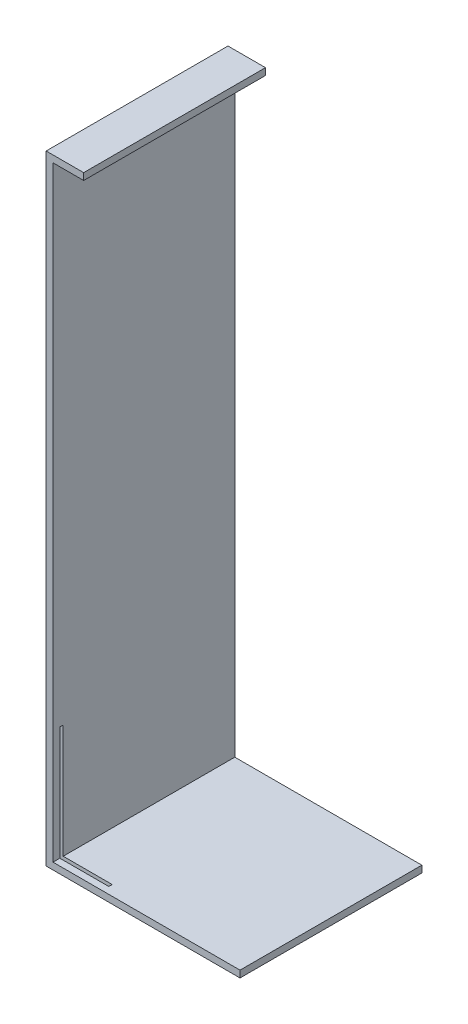
ISO-10303-21;
HEADER;
FILE_DESCRIPTION(('STEP AP214'),'2;1');
FILE_NAME('part.step','',(''),(''),'','','');
FILE_SCHEMA(('AUTOMOTIVE_DESIGN { 1 0 10303 214 1 1 1 1 }'));
ENDSEC;
DATA;
#1=APPLICATION_CONTEXT('core data for automotive mechanical design processes');
#2=APPLICATION_PROTOCOL_DEFINITION('international standard','automotive_design',2000,#1);
#3=PRODUCT_CONTEXT('',#1,'mechanical');
#4=PRODUCT('Part','Part','',(#3));
#5=PRODUCT_RELATED_PRODUCT_CATEGORY('part','',(#4));
#6=PRODUCT_DEFINITION_FORMATION('','',#4);
#7=PRODUCT_DEFINITION_CONTEXT('part definition',#1,'design');
#8=PRODUCT_DEFINITION('design','',#6,#7);
#9=PRODUCT_DEFINITION_SHAPE('','',#8);
#10=(LENGTH_UNIT() NAMED_UNIT(*) SI_UNIT(.MILLI.,.METRE.));
#11=(NAMED_UNIT(*) PLANE_ANGLE_UNIT() SI_UNIT($,.RADIAN.));
#12=(NAMED_UNIT(*) SI_UNIT($,.STERADIAN.) SOLID_ANGLE_UNIT());
#13=UNCERTAINTY_MEASURE_WITH_UNIT(LENGTH_MEASURE(1.E-05),#10,'distance_accuracy_value','');
#14=(GEOMETRIC_REPRESENTATION_CONTEXT(3) GLOBAL_UNCERTAINTY_ASSIGNED_CONTEXT((#13)) GLOBAL_UNIT_ASSIGNED_CONTEXT((#10,
#11,#12)) REPRESENTATION_CONTEXT('',''));
#15=CARTESIAN_POINT('',(0.,0.,0.));
#16=DIRECTION('',(0.,0.,1.));
#17=DIRECTION('',(1.,0.,0.));
#18=AXIS2_PLACEMENT_3D('',#15,#16,#17);
#19=CARTESIAN_POINT('',(2.99999999999998,-48.8350220264317,-80.));
#20=DIRECTION('',(0.,1.,0.));
#21=DIRECTION('',(-1.,0.,0.));
#22=AXIS2_PLACEMENT_3D('',#19,#20,#21);
#23=PLANE('',#22);
#24=DIRECTION('',(0.,0.,1.));
#25=VECTOR('',#24,1.);
#26=CARTESIAN_POINT('',(2.99999999999998,-48.8350220264317,-80.));
#27=LINE('',#26,#25);
#28=CARTESIAN_POINT('',(2.99999999999998,-48.8350220264317,-80.));
#29=VERTEX_POINT('',#28);
#30=CARTESIAN_POINT('',(2.99999999999998,-48.8350220264317,-4.5));
#31=VERTEX_POINT('',#30);
#32=EDGE_CURVE('E125',#29,#31,#27,.T.);
#33=ORIENTED_EDGE('',*,*,#32,.T.);
#34=DIRECTION('',(1.,0.,0.));
#35=VECTOR('',#34,1.);
#36=CARTESIAN_POINT('',(1.49999999999998,-48.8350220264317,-4.5));
#37=LINE('',#36,#35);
#38=CARTESIAN_POINT('',(24.5634122832143,-48.8350220264317,-4.5));
#39=VERTEX_POINT('',#38);
#40=EDGE_CURVE('E273',#31,#39,#37,.T.);
#41=ORIENTED_EDGE('',*,*,#40,.T.);
#42=DIRECTION('',(0.,0.,1.));
#43=VECTOR('',#42,1.);
#44=CARTESIAN_POINT('',(24.5634122832143,-48.8350220264317,-4.5));
#45=LINE('',#44,#43);
#46=CARTESIAN_POINT('',(24.5634122832143,-48.8350220264317,-3.));
#47=VERTEX_POINT('',#46);
#48=EDGE_CURVE('E362',#39,#47,#45,.T.);
#49=ORIENTED_EDGE('',*,*,#48,.T.);
#50=DIRECTION('',(1.,0.,0.));
#51=VECTOR('',#50,1.);
#52=CARTESIAN_POINT('',(2.83445578991728,-48.8350220264317,-3.));
#53=LINE('',#52,#51);
#54=CARTESIAN_POINT('',(2.99999999999998,-48.8350220264317,-3.));
#55=VERTEX_POINT('',#54);
#56=EDGE_CURVE('E289',#55,#47,#53,.T.);
#57=ORIENTED_EDGE('',*,*,#56,.F.);
#58=CARTESIAN_POINT('',(2.99999999999998,-48.8350220264317,0.));
#59=VERTEX_POINT('',#58);
#60=EDGE_CURVE('E185',#55,#59,#27,.T.);
#61=ORIENTED_EDGE('',*,*,#60,.T.);
#62=DIRECTION('',(-1.,0.,0.));
#63=VECTOR('',#62,1.);
#64=CARTESIAN_POINT('',(2.99999999999998,-48.8350220264317,0.));
#65=LINE('',#64,#63);
#66=CARTESIAN_POINT('',(85.3,-48.8350220264317,0.));
#67=VERTEX_POINT('',#66);
#68=EDGE_CURVE('E167',#67,#59,#65,.T.);
#69=ORIENTED_EDGE('',*,*,#68,.F.);
#70=DIRECTION('',(0.,0.,1.));
#71=VECTOR('',#70,1.);
#72=CARTESIAN_POINT('',(85.3,-48.8350220264317,-80.));
#73=LINE('',#72,#71);
#74=CARTESIAN_POINT('',(85.3,-48.8350220264317,-80.));
#75=VERTEX_POINT('',#74);
#76=EDGE_CURVE('E186',#75,#67,#73,.T.);
#77=ORIENTED_EDGE('',*,*,#76,.F.);
#78=DIRECTION('',(-1.,0.,0.));
#79=VECTOR('',#78,1.);
#80=CARTESIAN_POINT('',(2.99999999999998,-48.8350220264317,-80.));
#81=LINE('',#80,#79);
#82=EDGE_CURVE('E141',#75,#29,#81,.T.);
#83=ORIENTED_EDGE('',*,*,#82,.T.);
#84=EDGE_LOOP('',(#33,#41,#49,#57,#61,#69,#77,#83));
#85=FACE_BOUND('',#84,.T.);
#86=ADVANCED_FACE('F39',(#85),#23,.T.);
#87=CARTESIAN_POINT('',(0.,220.664977973568,-80.));
#88=DIRECTION('',(0.,1.,0.));
#89=DIRECTION('',(0.,0.,1.));
#90=AXIS2_PLACEMENT_3D('',#87,#88,#89);
#91=PLANE('',#90);
#92=DIRECTION('',(-1.,0.,0.));
#93=VECTOR('',#92,1.);
#94=CARTESIAN_POINT('',(0.,220.664977973568,0.));
#95=LINE('',#94,#93);
#96=CARTESIAN_POINT('',(16.5,220.664977973568,0.));
#97=VERTEX_POINT('',#96);
#98=CARTESIAN_POINT('',(0.,220.664977973568,0.));
#99=VERTEX_POINT('',#98);
#100=EDGE_CURVE('E150',#97,#99,#95,.T.);
#101=ORIENTED_EDGE('',*,*,#100,.F.);
#102=DIRECTION('',(0.,0.,1.));
#103=VECTOR('',#102,1.);
#104=CARTESIAN_POINT('',(16.5,220.664977973568,-80.));
#105=LINE('',#104,#103);
#106=CARTESIAN_POINT('',(16.5,220.664977973568,-80.));
#107=VERTEX_POINT('',#106);
#108=EDGE_CURVE('E11',#107,#97,#105,.T.);
#109=ORIENTED_EDGE('',*,*,#108,.F.);
#110=DIRECTION('',(-1.,0.,0.));
#111=VECTOR('',#110,1.);
#112=CARTESIAN_POINT('',(0.,220.664977973568,-80.));
#113=LINE('',#112,#111);
#114=CARTESIAN_POINT('',(0.,220.664977973568,-80.));
#115=VERTEX_POINT('',#114);
#116=EDGE_CURVE('E179',#107,#115,#113,.T.);
#117=ORIENTED_EDGE('',*,*,#116,.T.);
#118=DIRECTION('',(0.,0.,1.));
#119=VECTOR('',#118,1.);
#120=CARTESIAN_POINT('',(0.,220.664977973568,-80.));
#121=LINE('',#120,#119);
#122=EDGE_CURVE('E43',#115,#99,#121,.T.);
#123=ORIENTED_EDGE('',*,*,#122,.T.);
#124=EDGE_LOOP('',(#101,#109,#117,#123));
#125=FACE_BOUND('',#124,.T.);
#126=ADVANCED_FACE('F41',(#125),#91,.T.);
#127=CARTESIAN_POINT('',(16.5,220.664977973568,-80.));
#128=DIRECTION('',(1.,0.,0.));
#129=DIRECTION('',(0.,0.,-1.));
#130=AXIS2_PLACEMENT_3D('',#127,#128,#129);
#131=PLANE('',#130);
#132=DIRECTION('',(0.,1.,0.));
#133=VECTOR('',#132,1.);
#134=CARTESIAN_POINT('',(16.5,220.664977973568,0.));
#135=LINE('',#134,#133);
#136=CARTESIAN_POINT('',(16.5,217.664977973568,0.));
#137=VERTEX_POINT('',#136);
#138=EDGE_CURVE('E176',#137,#97,#135,.T.);
#139=ORIENTED_EDGE('',*,*,#138,.F.);
#140=DIRECTION('',(0.,0.,1.));
#141=VECTOR('',#140,1.);
#142=CARTESIAN_POINT('',(16.5,217.664977973568,-80.));
#143=LINE('',#142,#141);
#144=CARTESIAN_POINT('',(16.5,217.664977973568,-80.));
#145=VERTEX_POINT('',#144);
#146=EDGE_CURVE('E50',#145,#137,#143,.T.);
#147=ORIENTED_EDGE('',*,*,#146,.F.);
#148=DIRECTION('',(0.,1.,0.));
#149=VECTOR('',#148,1.);
#150=CARTESIAN_POINT('',(16.5,220.664977973568,-80.));
#151=LINE('',#150,#149);
#152=EDGE_CURVE('E133',#145,#107,#151,.T.);
#153=ORIENTED_EDGE('',*,*,#152,.T.);
#154=ORIENTED_EDGE('',*,*,#108,.T.);
#155=EDGE_LOOP('',(#139,#147,#153,#154));
#156=FACE_BOUND('',#155,.T.);
#157=ADVANCED_FACE('F198',(#156),#131,.T.);
#158=CARTESIAN_POINT('',(2.99999999999998,217.664977973568,-80.));
#159=DIRECTION('',(0.,-1.,0.));
#160=DIRECTION('',(0.,0.,-1.));
#161=AXIS2_PLACEMENT_3D('',#158,#159,#160);
#162=PLANE('',#161);
#163=DIRECTION('',(1.,0.,0.));
#164=VECTOR('',#163,1.);
#165=CARTESIAN_POINT('',(2.99999999999998,217.664977973568,0.));
#166=LINE('',#165,#164);
#167=CARTESIAN_POINT('',(2.99999999999998,217.664977973568,0.));
#168=VERTEX_POINT('',#167);
#169=EDGE_CURVE('E119',#168,#137,#166,.T.);
#170=ORIENTED_EDGE('',*,*,#169,.F.);
#171=DIRECTION('',(0.,0.,1.));
#172=VECTOR('',#171,1.);
#173=CARTESIAN_POINT('',(2.99999999999998,217.664977973568,-80.));
#174=LINE('',#173,#172);
#175=CARTESIAN_POINT('',(2.99999999999998,217.664977973568,-80.));
#176=VERTEX_POINT('',#175);
#177=EDGE_CURVE('E114',#176,#168,#174,.T.);
#178=ORIENTED_EDGE('',*,*,#177,.F.);
#179=DIRECTION('',(1.,0.,0.));
#180=VECTOR('',#179,1.);
#181=CARTESIAN_POINT('',(2.99999999999998,217.664977973568,-80.));
#182=LINE('',#181,#180);
#183=EDGE_CURVE('E117',#176,#145,#182,.T.);
#184=ORIENTED_EDGE('',*,*,#183,.T.);
#185=ORIENTED_EDGE('',*,*,#146,.T.);
#186=EDGE_LOOP('',(#170,#178,#184,#185));
#187=FACE_BOUND('',#186,.T.);
#188=ADVANCED_FACE('F116',(#187),#162,.T.);
#189=CARTESIAN_POINT('',(2.99999999999998,217.664977973568,-80.));
#190=DIRECTION('',(1.,0.,0.));
#191=DIRECTION('',(0.,0.,-1.));
#192=AXIS2_PLACEMENT_3D('',#189,#190,#191);
#193=PLANE('',#192);
#194=DIRECTION('',(0.,-1.,0.));
#195=VECTOR('',#194,1.);
#196=CARTESIAN_POINT('',(2.99999999999998,-48.8350220264317,-3.));
#197=LINE('',#196,#195);
#198=CARTESIAN_POINT('',(2.99999999999998,1.16497797356831,-3.));
#199=VERTEX_POINT('',#198);
#200=EDGE_CURVE('E294',#199,#55,#197,.T.);
#201=ORIENTED_EDGE('',*,*,#200,.F.);
#202=DIRECTION('',(0.,0.,1.));
#203=VECTOR('',#202,1.);
#204=CARTESIAN_POINT('',(2.99999999999998,1.16497797356831,-3.));
#205=LINE('',#204,#203);
#206=CARTESIAN_POINT('',(2.99999999999998,1.16497797356831,-4.5));
#207=VERTEX_POINT('',#206);
#208=EDGE_CURVE('E304',#207,#199,#205,.T.);
#209=ORIENTED_EDGE('',*,*,#208,.F.);
#210=DIRECTION('',(0.,1.,0.));
#211=VECTOR('',#210,1.);
#212=CARTESIAN_POINT('',(2.99999999999998,-48.8350220264317,-4.5));
#213=LINE('',#212,#211);
#214=EDGE_CURVE('E315',#31,#207,#213,.T.);
#215=ORIENTED_EDGE('',*,*,#214,.F.);
#216=ORIENTED_EDGE('',*,*,#32,.F.);
#217=DIRECTION('',(0.,1.,0.));
#218=VECTOR('',#217,1.);
#219=CARTESIAN_POINT('',(2.99999999999998,217.664977973568,-80.));
#220=LINE('',#219,#218);
#221=EDGE_CURVE('E131',#29,#176,#220,.T.);
#222=ORIENTED_EDGE('',*,*,#221,.T.);
#223=ORIENTED_EDGE('',*,*,#177,.T.);
#224=DIRECTION('',(0.,1.,0.));
#225=VECTOR('',#224,1.);
#226=CARTESIAN_POINT('',(2.99999999999998,217.664977973568,0.));
#227=LINE('',#226,#225);
#228=EDGE_CURVE('E171',#59,#168,#227,.T.);
#229=ORIENTED_EDGE('',*,*,#228,.F.);
#230=ORIENTED_EDGE('',*,*,#60,.F.);
#231=EDGE_LOOP('',(#201,#209,#215,#216,#222,#223,#229,#230));
#232=FACE_BOUND('',#231,.T.);
#233=ADVANCED_FACE('F137',(#232),#193,.T.);
#234=CARTESIAN_POINT('',(85.3,-48.8350220264317,-80.));
#235=DIRECTION('',(1.,0.,0.));
#236=DIRECTION('',(0.,0.,-1.));
#237=AXIS2_PLACEMENT_3D('',#234,#235,#236);
#238=PLANE('',#237);
#239=DIRECTION('',(0.,1.,0.));
#240=VECTOR('',#239,1.);
#241=CARTESIAN_POINT('',(85.3,-48.8350220264317,0.));
#242=LINE('',#241,#240);
#243=CARTESIAN_POINT('',(85.3,-51.8350220264317,0.));
#244=VERTEX_POINT('',#243);
#245=EDGE_CURVE('E163',#244,#67,#242,.T.);
#246=ORIENTED_EDGE('',*,*,#245,.F.);
#247=DIRECTION('',(0.,0.,1.));
#248=VECTOR('',#247,1.);
#249=CARTESIAN_POINT('',(85.3,-51.8350220264317,-80.));
#250=LINE('',#249,#248);
#251=CARTESIAN_POINT('',(85.3,-51.8350220264317,-80.));
#252=VERTEX_POINT('',#251);
#253=EDGE_CURVE('E189',#252,#244,#250,.T.);
#254=ORIENTED_EDGE('',*,*,#253,.F.);
#255=DIRECTION('',(0.,1.,0.));
#256=VECTOR('',#255,1.);
#257=CARTESIAN_POINT('',(85.3,-48.8350220264317,-80.));
#258=LINE('',#257,#256);
#259=EDGE_CURVE('E144',#252,#75,#258,.T.);
#260=ORIENTED_EDGE('',*,*,#259,.T.);
#261=ORIENTED_EDGE('',*,*,#76,.T.);
#262=EDGE_LOOP('',(#246,#254,#260,#261));
#263=FACE_BOUND('',#262,.T.);
#264=ADVANCED_FACE('F214',(#263),#238,.T.);
#265=CARTESIAN_POINT('',(0.,-51.8350220264317,-80.));
#266=DIRECTION('',(0.,-1.,0.));
#267=DIRECTION('',(0.,0.,-1.));
#268=AXIS2_PLACEMENT_3D('',#265,#266,#267);
#269=PLANE('',#268);
#270=DIRECTION('',(1.,0.,0.));
#271=VECTOR('',#270,1.);
#272=CARTESIAN_POINT('',(0.,-51.8350220264317,0.));
#273=LINE('',#272,#271);
#274=CARTESIAN_POINT('',(0.,-51.8350220264317,0.));
#275=VERTEX_POINT('',#274);
#276=EDGE_CURVE('E159',#275,#244,#273,.T.);
#277=ORIENTED_EDGE('',*,*,#276,.F.);
#278=DIRECTION('',(0.,0.,1.));
#279=VECTOR('',#278,1.);
#280=CARTESIAN_POINT('',(0.,-51.8350220264317,-80.));
#281=LINE('',#280,#279);
#282=CARTESIAN_POINT('',(0.,-51.8350220264317,-80.));
#283=VERTEX_POINT('',#282);
#284=EDGE_CURVE('E191',#283,#275,#281,.T.);
#285=ORIENTED_EDGE('',*,*,#284,.F.);
#286=DIRECTION('',(1.,0.,0.));
#287=VECTOR('',#286,1.);
#288=CARTESIAN_POINT('',(0.,-51.8350220264317,-80.));
#289=LINE('',#288,#287);
#290=EDGE_CURVE('E333',#283,#252,#289,.T.);
#291=ORIENTED_EDGE('',*,*,#290,.T.);
#292=ORIENTED_EDGE('',*,*,#253,.T.);
#293=EDGE_LOOP('',(#277,#285,#291,#292));
#294=FACE_BOUND('',#293,.T.);
#295=ADVANCED_FACE('F217',(#294),#269,.T.);
#296=CARTESIAN_POINT('',(0.,220.664977973568,-80.));
#297=DIRECTION('',(-1.,0.,0.));
#298=DIRECTION('',(0.,-1.,0.));
#299=AXIS2_PLACEMENT_3D('',#296,#297,#298);
#300=PLANE('',#299);
#301=DIRECTION('',(0.,-1.,0.));
#302=VECTOR('',#301,1.);
#303=CARTESIAN_POINT('',(0.,220.664977973568,0.));
#304=LINE('',#303,#302);
#305=EDGE_CURVE('E154',#99,#275,#304,.T.);
#306=ORIENTED_EDGE('',*,*,#305,.F.);
#307=ORIENTED_EDGE('',*,*,#122,.F.);
#308=DIRECTION('',(0.,-1.,0.));
#309=VECTOR('',#308,1.);
#310=CARTESIAN_POINT('',(0.,220.664977973568,-80.));
#311=LINE('',#310,#309);
#312=EDGE_CURVE('E330',#115,#283,#311,.T.);
#313=ORIENTED_EDGE('',*,*,#312,.T.);
#314=ORIENTED_EDGE('',*,*,#284,.T.);
#315=EDGE_LOOP('',(#306,#307,#313,#314));
#316=FACE_BOUND('',#315,.T.);
#317=ADVANCED_FACE('F195',(#316),#300,.T.);
#318=CARTESIAN_POINT('',(0.,0.,-80.));
#319=DIRECTION('',(0.,0.,-1.));
#320=DIRECTION('',(-1.,0.,0.));
#321=AXIS2_PLACEMENT_3D('',#318,#319,#320);
#322=PLANE('',#321);
#323=ORIENTED_EDGE('',*,*,#116,.F.);
#324=ORIENTED_EDGE('',*,*,#152,.F.);
#325=ORIENTED_EDGE('',*,*,#183,.F.);
#326=ORIENTED_EDGE('',*,*,#221,.F.);
#327=ORIENTED_EDGE('',*,*,#82,.F.);
#328=ORIENTED_EDGE('',*,*,#259,.F.);
#329=ORIENTED_EDGE('',*,*,#290,.F.);
#330=ORIENTED_EDGE('',*,*,#312,.F.);
#331=EDGE_LOOP('',(#323,#324,#325,#326,#327,#328,#329,#330));
#332=FACE_BOUND('',#331,.T.);
#333=ADVANCED_FACE('F129',(#332),#322,.T.);
#334=CARTESIAN_POINT('',(0.,0.,0.));
#335=DIRECTION('',(0.,0.,-1.));
#336=DIRECTION('',(-1.,0.,0.));
#337=AXIS2_PLACEMENT_3D('',#334,#335,#336);
#338=PLANE('',#337);
#339=ORIENTED_EDGE('',*,*,#100,.T.);
#340=ORIENTED_EDGE('',*,*,#305,.T.);
#341=ORIENTED_EDGE('',*,*,#276,.T.);
#342=ORIENTED_EDGE('',*,*,#245,.T.);
#343=ORIENTED_EDGE('',*,*,#68,.T.);
#344=ORIENTED_EDGE('',*,*,#228,.T.);
#345=ORIENTED_EDGE('',*,*,#169,.T.);
#346=ORIENTED_EDGE('',*,*,#138,.T.);
#347=EDGE_LOOP('',(#339,#340,#341,#342,#343,#344,#345,#346));
#348=FACE_BOUND('',#347,.T.);
#349=ADVANCED_FACE('F197',(#348),#338,.F.);
#350=CARTESIAN_POINT('',(1.49999999999998,-48.8350220264317,-3.));
#351=DIRECTION('',(0.,0.,1.));
#352=DIRECTION('',(0.,-1.,0.));
#353=AXIS2_PLACEMENT_3D('',#350,#351,#352);
#354=PLANE('',#353);
#355=ORIENTED_EDGE('',*,*,#200,.T.);
#356=ORIENTED_EDGE('',*,*,#56,.T.);
#357=DIRECTION('',(0.,1.,0.));
#358=VECTOR('',#357,1.);
#359=CARTESIAN_POINT('',(24.5634122832143,-50.3350220264317,-3.));
#360=LINE('',#359,#358);
#361=CARTESIAN_POINT('',(24.5634122832143,-50.3350220264317,-3.));
#362=VERTEX_POINT('',#361);
#363=EDGE_CURVE('E279',#362,#47,#360,.T.);
#364=ORIENTED_EDGE('',*,*,#363,.F.);
#365=DIRECTION('',(1.,0.,0.));
#366=VECTOR('',#365,1.);
#367=CARTESIAN_POINT('',(1.49999999999998,-50.3350220264317,-3.));
#368=LINE('',#367,#366);
#369=CARTESIAN_POINT('',(1.49999999999998,-50.3350220264317,-3.));
#370=VERTEX_POINT('',#369);
#371=EDGE_CURVE('E260',#370,#362,#368,.T.);
#372=ORIENTED_EDGE('',*,*,#371,.F.);
#373=DIRECTION('',(0.,-1.,0.));
#374=VECTOR('',#373,1.);
#375=CARTESIAN_POINT('',(1.49999999999998,-48.8350220264317,-3.));
#376=LINE('',#375,#374);
#377=CARTESIAN_POINT('',(1.49999999999998,1.16497797356831,-3.));
#378=VERTEX_POINT('',#377);
#379=EDGE_CURVE('E299',#378,#370,#376,.T.);
#380=ORIENTED_EDGE('',*,*,#379,.F.);
#381=DIRECTION('',(1.,0.,0.));
#382=VECTOR('',#381,1.);
#383=CARTESIAN_POINT('',(1.49999999999998,1.16497797356831,-3.));
#384=LINE('',#383,#382);
#385=EDGE_CURVE('E155',#378,#199,#384,.T.);
#386=ORIENTED_EDGE('',*,*,#385,.T.);
#387=EDGE_LOOP('',(#355,#356,#364,#372,#380,#386));
#388=FACE_BOUND('',#387,.T.);
#389=ADVANCED_FACE('F229',(#388),#354,.F.);
#390=CARTESIAN_POINT('',(1.49999999999998,1.16497797356831,-3.));
#391=DIRECTION('',(0.,1.,0.));
#392=DIRECTION('',(0.,0.,1.));
#393=AXIS2_PLACEMENT_3D('',#390,#391,#392);
#394=PLANE('',#393);
#395=ORIENTED_EDGE('',*,*,#208,.T.);
#396=ORIENTED_EDGE('',*,*,#385,.F.);
#397=DIRECTION('',(0.,0.,1.));
#398=VECTOR('',#397,1.);
#399=CARTESIAN_POINT('',(1.49999999999998,1.16497797356831,-3.));
#400=LINE('',#399,#398);
#401=CARTESIAN_POINT('',(1.49999999999998,1.16497797356831,-4.5));
#402=VERTEX_POINT('',#401);
#403=EDGE_CURVE('E308',#402,#378,#400,.T.);
#404=ORIENTED_EDGE('',*,*,#403,.F.);
#405=DIRECTION('',(1.,0.,0.));
#406=VECTOR('',#405,1.);
#407=CARTESIAN_POINT('',(1.49999999999998,1.16497797356831,-4.5));
#408=LINE('',#407,#406);
#409=EDGE_CURVE('E312',#402,#207,#408,.T.);
#410=ORIENTED_EDGE('',*,*,#409,.T.);
#411=EDGE_LOOP('',(#395,#396,#404,#410));
#412=FACE_BOUND('',#411,.T.);
#413=ADVANCED_FACE('F233',(#412),#394,.F.);
#414=CARTESIAN_POINT('',(1.49999999999998,-48.8350220264317,-4.5));
#415=DIRECTION('',(0.,0.,-1.));
#416=DIRECTION('',(-1.,0.,0.));
#417=AXIS2_PLACEMENT_3D('',#414,#415,#416);
#418=PLANE('',#417);
#419=ORIENTED_EDGE('',*,*,#214,.T.);
#420=ORIENTED_EDGE('',*,*,#409,.F.);
#421=DIRECTION('',(0.,1.,0.));
#422=VECTOR('',#421,1.);
#423=CARTESIAN_POINT('',(1.49999999999998,-48.8350220264317,-4.5));
#424=LINE('',#423,#422);
#425=CARTESIAN_POINT('',(1.49999999999998,-50.3350220264317,-4.5));
#426=VERTEX_POINT('',#425);
#427=EDGE_CURVE('E303',#426,#402,#424,.T.);
#428=ORIENTED_EDGE('',*,*,#427,.F.);
#429=DIRECTION('',(1.,0.,0.));
#430=VECTOR('',#429,1.);
#431=CARTESIAN_POINT('',(1.49999999999998,-50.3350220264317,-4.5));
#432=LINE('',#431,#430);
#433=CARTESIAN_POINT('',(24.5634122832143,-50.3350220264317,-4.5));
#434=VERTEX_POINT('',#433);
#435=EDGE_CURVE('E284',#426,#434,#432,.T.);
#436=ORIENTED_EDGE('',*,*,#435,.T.);
#437=DIRECTION('',(0.,1.,0.));
#438=VECTOR('',#437,1.);
#439=CARTESIAN_POINT('',(24.5634122832143,-50.3350220264317,-4.5));
#440=LINE('',#439,#438);
#441=EDGE_CURVE('E282',#434,#39,#440,.T.);
#442=ORIENTED_EDGE('',*,*,#441,.T.);
#443=ORIENTED_EDGE('',*,*,#40,.F.);
#444=EDGE_LOOP('',(#419,#420,#428,#436,#442,#443));
#445=FACE_BOUND('',#444,.T.);
#446=ADVANCED_FACE('F235',(#445),#418,.F.);
#447=CARTESIAN_POINT('',(1.49999999999998,0.,0.));
#448=DIRECTION('',(-1.,0.,0.));
#449=DIRECTION('',(0.,0.,1.));
#450=AXIS2_PLACEMENT_3D('',#447,#448,#449);
#451=PLANE('',#450);
#452=ORIENTED_EDGE('',*,*,#379,.T.);
#453=DIRECTION('',(0.,0.,1.));
#454=VECTOR('',#453,1.);
#455=CARTESIAN_POINT('',(1.49999999999998,-50.3350220264317,-4.5));
#456=LINE('',#455,#454);
#457=EDGE_CURVE('E267',#426,#370,#456,.T.);
#458=ORIENTED_EDGE('',*,*,#457,.F.);
#459=ORIENTED_EDGE('',*,*,#427,.T.);
#460=ORIENTED_EDGE('',*,*,#403,.T.);
#461=EDGE_LOOP('',(#452,#458,#459,#460));
#462=FACE_BOUND('',#461,.T.);
#463=ADVANCED_FACE('F238',(#462),#451,.F.);
#464=CARTESIAN_POINT('',(24.5634122832143,-50.3350220264317,-4.5));
#465=DIRECTION('',(-1.,0.,0.));
#466=DIRECTION('',(0.,-1.,0.));
#467=AXIS2_PLACEMENT_3D('',#464,#465,#466);
#468=PLANE('',#467);
#469=ORIENTED_EDGE('',*,*,#48,.F.);
#470=ORIENTED_EDGE('',*,*,#441,.F.);
#471=DIRECTION('',(0.,0.,1.));
#472=VECTOR('',#471,1.);
#473=CARTESIAN_POINT('',(24.5634122832143,-50.3350220264317,-4.5));
#474=LINE('',#473,#472);
#475=EDGE_CURVE('E264',#434,#362,#474,.T.);
#476=ORIENTED_EDGE('',*,*,#475,.T.);
#477=ORIENTED_EDGE('',*,*,#363,.T.);
#478=EDGE_LOOP('',(#469,#470,#476,#477));
#479=FACE_BOUND('',#478,.T.);
#480=ADVANCED_FACE('F245',(#479),#468,.T.);
#481=CARTESIAN_POINT('',(0.,-50.3350220264317,0.));
#482=DIRECTION('',(0.,-1.,0.));
#483=DIRECTION('',(0.,0.,-1.));
#484=AXIS2_PLACEMENT_3D('',#481,#482,#483);
#485=PLANE('',#484);
#486=ORIENTED_EDGE('',*,*,#371,.T.);
#487=ORIENTED_EDGE('',*,*,#475,.F.);
#488=ORIENTED_EDGE('',*,*,#435,.F.);
#489=ORIENTED_EDGE('',*,*,#457,.T.);
#490=EDGE_LOOP('',(#486,#487,#488,#489));
#491=FACE_BOUND('',#490,.T.);
#492=ADVANCED_FACE('F249',(#491),#485,.F.);
#493=CLOSED_SHELL('',(#86,#126,#157,#188,#233,#264,#295,#317,#333,#349,#389,#413,#446,#463,#480,#492));
#494=MANIFOLD_SOLID_BREP('B2',#493);
#495=ADVANCED_BREP_SHAPE_REPRESENTATION('',(#18,#494),#14);
#496=SHAPE_DEFINITION_REPRESENTATION(#9,#495);
ENDSEC;
END-ISO-10303-21;
